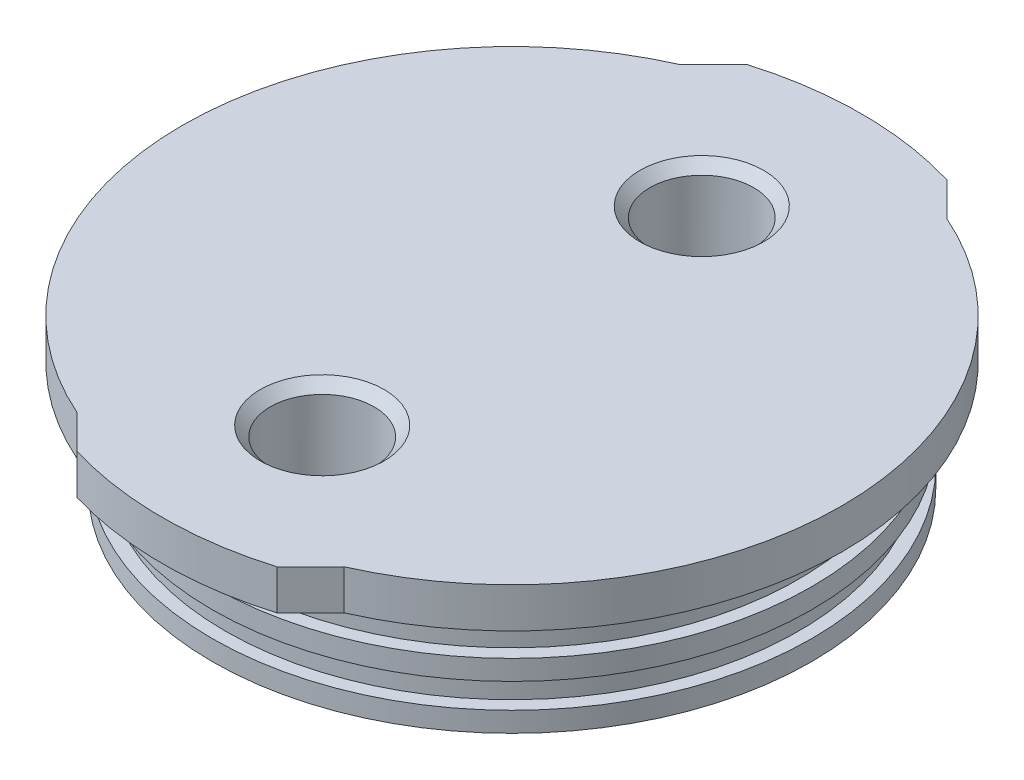
ISO-10303-21;
HEADER;
FILE_DESCRIPTION(('STEP AP214'),'2;1');
FILE_NAME('part.step','',(''),(''),'','','');
FILE_SCHEMA(('AUTOMOTIVE_DESIGN { 1 0 10303 214 1 1 1 1 }'));
ENDSEC;
DATA;
#1=APPLICATION_CONTEXT('core data for automotive mechanical design processes');
#2=APPLICATION_PROTOCOL_DEFINITION('international standard','automotive_design',2000,#1);
#3=PRODUCT_CONTEXT('',#1,'mechanical');
#4=PRODUCT('Part','Part','',(#3));
#5=PRODUCT_RELATED_PRODUCT_CATEGORY('part','',(#4));
#6=PRODUCT_DEFINITION_FORMATION('','',#4);
#7=PRODUCT_DEFINITION_CONTEXT('part definition',#1,'design');
#8=PRODUCT_DEFINITION('design','',#6,#7);
#9=PRODUCT_DEFINITION_SHAPE('','',#8);
#10=(LENGTH_UNIT() NAMED_UNIT(*) SI_UNIT(.MILLI.,.METRE.));
#11=(NAMED_UNIT(*) PLANE_ANGLE_UNIT() SI_UNIT($,.RADIAN.));
#12=(NAMED_UNIT(*) SI_UNIT($,.STERADIAN.) SOLID_ANGLE_UNIT());
#13=UNCERTAINTY_MEASURE_WITH_UNIT(LENGTH_MEASURE(1.E-05),#10,'distance_accuracy_value','');
#14=(GEOMETRIC_REPRESENTATION_CONTEXT(3) GLOBAL_UNCERTAINTY_ASSIGNED_CONTEXT((#13)) GLOBAL_UNIT_ASSIGNED_CONTEXT((#10,
#11,#12)) REPRESENTATION_CONTEXT('',''));
#15=CARTESIAN_POINT('',(0.,0.,0.));
#16=DIRECTION('',(0.,0.,1.));
#17=DIRECTION('',(1.,0.,0.));
#18=AXIS2_PLACEMENT_3D('',#15,#16,#17);
#19=CARTESIAN_POINT('',(0.,0.,0.));
#20=DIRECTION('',(0.,-1.,0.));
#21=DIRECTION('',(0.,0.,-1.));
#22=AXIS2_PLACEMENT_3D('',#19,#20,#21);
#23=CYLINDRICAL_SURFACE('',#22,33.);
#24=CARTESIAN_POINT('',(0.,11.,0.));
#25=DIRECTION('',(0.,-1.,0.));
#26=DIRECTION('',(0.,0.,-1.));
#27=AXIS2_PLACEMENT_3D('',#24,#25,#26);
#28=CIRCLE('',#27,33.);
#29=CARTESIAN_POINT('',(-13.3714085884062,11.,30.1696110740907));
#30=VERTEX_POINT('',#29);
#31=CARTESIAN_POINT('',(-13.3714085884061,11.,-30.1696110740907));
#32=VERTEX_POINT('',#31);
#33=EDGE_CURVE('E223',#30,#32,#28,.T.);
#34=ORIENTED_EDGE('',*,*,#33,.F.);
#35=DIRECTION('',(0.,1.,0.));
#36=VECTOR('',#35,1.);
#37=CARTESIAN_POINT('',(-13.3714085884061,-16.1755575421729,30.1696110740907));
#38=LINE('',#37,#36);
#39=CARTESIAN_POINT('',(-13.3714085884061,15.,30.1696110740907));
#40=VERTEX_POINT('',#39);
#41=EDGE_CURVE('E37',#30,#40,#38,.T.);
#42=ORIENTED_EDGE('',*,*,#41,.T.);
#43=CARTESIAN_POINT('',(0.,15.,0.));
#44=DIRECTION('',(0.,-1.,0.));
#45=DIRECTION('',(0.,0.,-1.));
#46=AXIS2_PLACEMENT_3D('',#43,#44,#45);
#47=CIRCLE('',#46,33.);
#48=CARTESIAN_POINT('',(-13.3714085884061,15.,-30.1696110740907));
#49=VERTEX_POINT('',#48);
#50=EDGE_CURVE('E228',#40,#49,#47,.T.);
#51=ORIENTED_EDGE('',*,*,#50,.T.);
#52=DIRECTION('',(0.,1.,0.));
#53=VECTOR('',#52,1.);
#54=CARTESIAN_POINT('',(-13.3714085884061,-16.1755575421729,-30.1696110740907));
#55=LINE('',#54,#53);
#56=EDGE_CURVE('E175',#32,#49,#55,.T.);
#57=ORIENTED_EDGE('',*,*,#56,.F.);
#58=EDGE_LOOP('',(#34,#42,#51,#57));
#59=FACE_BOUND('',#58,.T.);
#60=ADVANCED_FACE('F17',(#59),#23,.T.);
#61=CARTESIAN_POINT('',(0.,15.,0.));
#62=DIRECTION('',(0.,-1.,0.));
#63=DIRECTION('',(0.,0.,-1.));
#64=AXIS2_PLACEMENT_3D('',#61,#62,#63);
#65=PLANE('',#64);
#66=CARTESIAN_POINT('',(0.,15.,19.));
#67=DIRECTION('',(0.,-1.,0.));
#68=DIRECTION('',(0.,0.,-1.));
#69=AXIS2_PLACEMENT_3D('',#66,#67,#68);
#70=CIRCLE('',#69,6.2);
#71=CARTESIAN_POINT('',(0.,15.,12.8));
#72=VERTEX_POINT('',#71);
#73=EDGE_CURVE('E248',#72,#72,#70,.T.);
#74=ORIENTED_EDGE('',*,*,#73,.T.);
#75=EDGE_LOOP('',(#74));
#76=FACE_BOUND('',#75,.T.);
#77=CARTESIAN_POINT('',(0.,15.,-19.));
#78=DIRECTION('',(0.,-1.,0.));
#79=DIRECTION('',(0.,0.,-1.));
#80=AXIS2_PLACEMENT_3D('',#77,#78,#79);
#81=CIRCLE('',#80,6.2);
#82=CARTESIAN_POINT('',(0.,15.,-25.2));
#83=VERTEX_POINT('',#82);
#84=EDGE_CURVE('E240',#83,#83,#81,.T.);
#85=ORIENTED_EDGE('',*,*,#84,.T.);
#86=EDGE_LOOP('',(#85));
#87=FACE_BOUND('',#86,.T.);
#88=CARTESIAN_POINT('',(13.3714085884061,15.,-30.1696110740907));
#89=VERTEX_POINT('',#88);
#90=CARTESIAN_POINT('',(13.3714085884061,15.,30.1696110740907));
#91=VERTEX_POINT('',#90);
#92=EDGE_CURVE('E229',#89,#91,#47,.T.);
#93=ORIENTED_EDGE('',*,*,#92,.F.);
#94=DIRECTION('',(-0.70710678118655,0.,-0.707106781186545));
#95=VECTOR('',#94,1.);
#96=CARTESIAN_POINT('',(10.,15.,-33.5410196624969));
#97=LINE('',#96,#95);
#98=CARTESIAN_POINT('',(10.,15.,-33.5410196624969));
#99=VERTEX_POINT('',#98);
#100=EDGE_CURVE('E162',#89,#99,#97,.T.);
#101=ORIENTED_EDGE('',*,*,#100,.T.);
#102=CARTESIAN_POINT('',(0.,15.,0.));
#103=DIRECTION('',(0.,1.,0.));
#104=DIRECTION('',(0.,0.,1.));
#105=AXIS2_PLACEMENT_3D('',#102,#103,#104);
#106=CIRCLE('',#105,35.);
#107=CARTESIAN_POINT('',(-10.,15.,-33.5410196624969));
#108=VERTEX_POINT('',#107);
#109=EDGE_CURVE('E166',#99,#108,#106,.T.);
#110=ORIENTED_EDGE('',*,*,#109,.T.);
#111=DIRECTION('',(-0.70710678118655,0.,0.707106781186545));
#112=VECTOR('',#111,1.);
#113=CARTESIAN_POINT('',(-10.,15.,-33.5410196624969));
#114=LINE('',#113,#112);
#115=EDGE_CURVE('E150',#108,#49,#114,.T.);
#116=ORIENTED_EDGE('',*,*,#115,.T.);
#117=ORIENTED_EDGE('',*,*,#50,.F.);
#118=DIRECTION('',(0.70710678118655,0.,0.707106781186545));
#119=VECTOR('',#118,1.);
#120=CARTESIAN_POINT('',(-10.,15.,33.5410196624969));
#121=LINE('',#120,#119);
#122=CARTESIAN_POINT('',(-10.,15.,33.5410196624969));
#123=VERTEX_POINT('',#122);
#124=EDGE_CURVE('E125',#40,#123,#121,.T.);
#125=ORIENTED_EDGE('',*,*,#124,.T.);
#126=CARTESIAN_POINT('',(0.,15.,0.));
#127=DIRECTION('',(0.,1.,0.));
#128=DIRECTION('',(0.,0.,-1.));
#129=AXIS2_PLACEMENT_3D('',#126,#127,#128);
#130=CIRCLE('',#129,35.);
#131=CARTESIAN_POINT('',(10.,15.,33.5410196624969));
#132=VERTEX_POINT('',#131);
#133=EDGE_CURVE('E110',#123,#132,#130,.T.);
#134=ORIENTED_EDGE('',*,*,#133,.T.);
#135=DIRECTION('',(0.70710678118655,0.,-0.707106781186545));
#136=VECTOR('',#135,1.);
#137=CARTESIAN_POINT('',(10.,15.,33.5410196624969));
#138=LINE('',#137,#136);
#139=EDGE_CURVE('E122',#132,#91,#138,.T.);
#140=ORIENTED_EDGE('',*,*,#139,.T.);
#141=EDGE_LOOP('',(#93,#101,#110,#116,#117,#125,#134,#140));
#142=FACE_BOUND('',#141,.T.);
#143=ADVANCED_FACE('F121',(#76,#87,#142),#65,.F.);
#144=CARTESIAN_POINT('',(-30.,0.,0.));
#145=DIRECTION('',(0.,1.,0.));
#146=DIRECTION('',(0.,0.,1.));
#147=AXIS2_PLACEMENT_3D('',#144,#145,#146);
#148=PLANE('',#147);
#149=CARTESIAN_POINT('',(0.,0.,19.));
#150=DIRECTION('',(0.,1.,0.));
#151=DIRECTION('',(0.,0.,1.));
#152=AXIS2_PLACEMENT_3D('',#149,#150,#151);
#153=CIRCLE('',#152,6.2);
#154=CARTESIAN_POINT('',(0.,0.,25.2));
#155=VERTEX_POINT('',#154);
#156=EDGE_CURVE('E11',#155,#155,#153,.T.);
#157=ORIENTED_EDGE('',*,*,#156,.T.);
#158=EDGE_LOOP('',(#157));
#159=FACE_BOUND('',#158,.T.);
#160=CARTESIAN_POINT('',(0.,0.,-19.));
#161=DIRECTION('',(0.,1.,0.));
#162=DIRECTION('',(0.,0.,1.));
#163=AXIS2_PLACEMENT_3D('',#160,#161,#162);
#164=CIRCLE('',#163,6.2);
#165=CARTESIAN_POINT('',(0.,0.,-12.8));
#166=VERTEX_POINT('',#165);
#167=EDGE_CURVE('E244',#166,#166,#164,.T.);
#168=ORIENTED_EDGE('',*,*,#167,.T.);
#169=EDGE_LOOP('',(#168));
#170=FACE_BOUND('',#169,.T.);
#171=CARTESIAN_POINT('',(0.,0.,0.));
#172=DIRECTION('',(0.,-1.,0.));
#173=DIRECTION('',(0.,0.,-1.));
#174=AXIS2_PLACEMENT_3D('',#171,#172,#173);
#175=CIRCLE('',#174,30.);
#176=CARTESIAN_POINT('',(0.,0.,-30.));
#177=VERTEX_POINT('',#176);
#178=EDGE_CURVE('E183',#177,#177,#175,.T.);
#179=ORIENTED_EDGE('',*,*,#178,.T.);
#180=EDGE_LOOP('',(#179));
#181=FACE_BOUND('',#180,.T.);
#182=ADVANCED_FACE('F270',(#159,#170,#181),#148,.F.);
#183=ORIENTED_EDGE('',*,*,#92,.T.);
#184=DIRECTION('',(0.,1.,0.));
#185=VECTOR('',#184,1.);
#186=CARTESIAN_POINT('',(13.3714085884061,-16.1755575421729,30.1696110740907));
#187=LINE('',#186,#185);
#188=CARTESIAN_POINT('',(13.3714085884061,11.,30.1696110740907));
#189=VERTEX_POINT('',#188);
#190=EDGE_CURVE('E115',#189,#91,#187,.T.);
#191=ORIENTED_EDGE('',*,*,#190,.F.);
#192=CARTESIAN_POINT('',(13.3714085884062,11.,-30.1696110740907));
#193=VERTEX_POINT('',#192);
#194=EDGE_CURVE('E224',#193,#189,#28,.T.);
#195=ORIENTED_EDGE('',*,*,#194,.F.);
#196=DIRECTION('',(0.,1.,0.));
#197=VECTOR('',#196,1.);
#198=CARTESIAN_POINT('',(13.3714085884061,-16.1755575421729,-30.1696110740907));
#199=LINE('',#198,#197);
#200=EDGE_CURVE('E47',#193,#89,#199,.T.);
#201=ORIENTED_EDGE('',*,*,#200,.T.);
#202=EDGE_LOOP('',(#183,#191,#195,#201));
#203=FACE_BOUND('',#202,.T.);
#204=ADVANCED_FACE('F295',(#203),#23,.T.);
#205=CARTESIAN_POINT('',(-33.,11.,0.));
#206=DIRECTION('',(0.,1.,0.));
#207=DIRECTION('',(0.,0.,1.));
#208=AXIS2_PLACEMENT_3D('',#205,#206,#207);
#209=PLANE('',#208);
#210=CARTESIAN_POINT('',(0.,11.,0.));
#211=DIRECTION('',(0.,-1.,0.));
#212=DIRECTION('',(0.,0.,-1.));
#213=AXIS2_PLACEMENT_3D('',#210,#211,#212);
#214=CIRCLE('',#213,30.);
#215=CARTESIAN_POINT('',(0.,11.,-30.));
#216=VERTEX_POINT('',#215);
#217=EDGE_CURVE('E219',#216,#216,#214,.T.);
#218=ORIENTED_EDGE('',*,*,#217,.F.);
#219=EDGE_LOOP('',(#218));
#220=FACE_BOUND('',#219,.T.);
#221=ORIENTED_EDGE('',*,*,#194,.T.);
#222=DIRECTION('',(-0.70710678118655,0.,0.707106781186545));
#223=VECTOR('',#222,1.);
#224=CARTESIAN_POINT('',(10.,11.,33.5410196624969));
#225=LINE('',#224,#223);
#226=CARTESIAN_POINT('',(10.,11.,33.5410196624969));
#227=VERTEX_POINT('',#226);
#228=EDGE_CURVE('E147',#189,#227,#225,.T.);
#229=ORIENTED_EDGE('',*,*,#228,.T.);
#230=CARTESIAN_POINT('',(0.,11.,0.));
#231=DIRECTION('',(0.,1.,0.));
#232=DIRECTION('',(0.,0.,1.));
#233=AXIS2_PLACEMENT_3D('',#230,#231,#232);
#234=CIRCLE('',#233,35.);
#235=CARTESIAN_POINT('',(-10.,11.,33.5410196624969));
#236=VERTEX_POINT('',#235);
#237=EDGE_CURVE('E111',#227,#236,#234,.F.);
#238=ORIENTED_EDGE('',*,*,#237,.T.);
#239=DIRECTION('',(-0.70710678118655,0.,-0.707106781186545));
#240=VECTOR('',#239,1.);
#241=CARTESIAN_POINT('',(-10.,11.,33.5410196624969));
#242=LINE('',#241,#240);
#243=EDGE_CURVE('E142',#236,#30,#242,.T.);
#244=ORIENTED_EDGE('',*,*,#243,.T.);
#245=ORIENTED_EDGE('',*,*,#33,.T.);
#246=DIRECTION('',(0.70710678118655,0.,-0.707106781186545));
#247=VECTOR('',#246,1.);
#248=CARTESIAN_POINT('',(-10.,11.,-33.5410196624969));
#249=LINE('',#248,#247);
#250=CARTESIAN_POINT('',(-10.,11.,-33.5410196624969));
#251=VERTEX_POINT('',#250);
#252=EDGE_CURVE('E158',#32,#251,#249,.T.);
#253=ORIENTED_EDGE('',*,*,#252,.T.);
#254=CARTESIAN_POINT('',(0.,11.,0.));
#255=DIRECTION('',(0.,1.,0.));
#256=DIRECTION('',(0.,0.,1.));
#257=AXIS2_PLACEMENT_3D('',#254,#255,#256);
#258=CIRCLE('',#257,35.);
#259=CARTESIAN_POINT('',(10.,11.,-33.5410196624969));
#260=VERTEX_POINT('',#259);
#261=EDGE_CURVE('E154',#251,#260,#258,.F.);
#262=ORIENTED_EDGE('',*,*,#261,.T.);
#263=DIRECTION('',(0.70710678118655,0.,0.707106781186545));
#264=VECTOR('',#263,1.);
#265=CARTESIAN_POINT('',(10.,11.,-33.5410196624969));
#266=LINE('',#265,#264);
#267=EDGE_CURVE('E151',#260,#193,#266,.T.);
#268=ORIENTED_EDGE('',*,*,#267,.T.);
#269=EDGE_LOOP('',(#221,#229,#238,#244,#245,#253,#262,#268));
#270=FACE_BOUND('',#269,.T.);
#271=ADVANCED_FACE('F350',(#220,#270),#209,.F.);
#272=CARTESIAN_POINT('',(0.,0.,0.));
#273=DIRECTION('',(0.,-1.,0.));
#274=DIRECTION('',(0.,0.,-1.));
#275=AXIS2_PLACEMENT_3D('',#272,#273,#274);
#276=CYLINDRICAL_SURFACE('',#275,30.);
#277=CARTESIAN_POINT('',(0.,9.,0.));
#278=DIRECTION('',(0.,-1.,0.));
#279=DIRECTION('',(0.,0.,-1.));
#280=AXIS2_PLACEMENT_3D('',#277,#278,#279);
#281=CIRCLE('',#280,30.);
#282=CARTESIAN_POINT('',(0.,9.,-30.));
#283=VERTEX_POINT('',#282);
#284=EDGE_CURVE('E215',#283,#283,#281,.T.);
#285=ORIENTED_EDGE('',*,*,#284,.F.);
#286=EDGE_LOOP('',(#285));
#287=FACE_BOUND('',#286,.T.);
#288=ORIENTED_EDGE('',*,*,#217,.T.);
#289=EDGE_LOOP('',(#288));
#290=FACE_BOUND('',#289,.T.);
#291=ADVANCED_FACE('F344',(#287,#290),#276,.T.);
#292=CARTESIAN_POINT('',(-30.,9.,0.));
#293=DIRECTION('',(0.,1.,0.));
#294=DIRECTION('',(0.,0.,1.));
#295=AXIS2_PLACEMENT_3D('',#292,#293,#294);
#296=PLANE('',#295);
#297=CARTESIAN_POINT('',(0.,9.,0.));
#298=DIRECTION('',(0.,-1.,0.));
#299=DIRECTION('',(0.,0.,-1.));
#300=AXIS2_PLACEMENT_3D('',#297,#298,#299);
#301=CIRCLE('',#300,28.7);
#302=CARTESIAN_POINT('',(0.,9.,-28.7));
#303=VERTEX_POINT('',#302);
#304=EDGE_CURVE('E211',#303,#303,#301,.T.);
#305=ORIENTED_EDGE('',*,*,#304,.F.);
#306=EDGE_LOOP('',(#305));
#307=FACE_BOUND('',#306,.T.);
#308=ORIENTED_EDGE('',*,*,#284,.T.);
#309=EDGE_LOOP('',(#308));
#310=FACE_BOUND('',#309,.T.);
#311=ADVANCED_FACE('F338',(#307,#310),#296,.F.);
#312=CARTESIAN_POINT('',(0.,0.,0.));
#313=DIRECTION('',(0.,-1.,0.));
#314=DIRECTION('',(0.,0.,-1.));
#315=AXIS2_PLACEMENT_3D('',#312,#313,#314);
#316=CYLINDRICAL_SURFACE('',#315,28.7);
#317=CARTESIAN_POINT('',(0.,6.5,0.));
#318=DIRECTION('',(0.,-1.,0.));
#319=DIRECTION('',(0.,0.,-1.));
#320=AXIS2_PLACEMENT_3D('',#317,#318,#319);
#321=CIRCLE('',#320,28.7);
#322=CARTESIAN_POINT('',(0.,6.5,-28.7));
#323=VERTEX_POINT('',#322);
#324=EDGE_CURVE('E207',#323,#323,#321,.T.);
#325=ORIENTED_EDGE('',*,*,#324,.F.);
#326=EDGE_LOOP('',(#325));
#327=FACE_BOUND('',#326,.T.);
#328=ORIENTED_EDGE('',*,*,#304,.T.);
#329=EDGE_LOOP('',(#328));
#330=FACE_BOUND('',#329,.T.);
#331=ADVANCED_FACE('F332',(#327,#330),#316,.T.);
#332=CARTESIAN_POINT('',(-28.7,6.5,0.));
#333=DIRECTION('',(0.,-1.,0.));
#334=DIRECTION('',(0.,0.,-1.));
#335=AXIS2_PLACEMENT_3D('',#332,#333,#334);
#336=PLANE('',#335);
#337=CARTESIAN_POINT('',(0.,6.5,0.));
#338=DIRECTION('',(0.,-1.,0.));
#339=DIRECTION('',(0.,0.,-1.));
#340=AXIS2_PLACEMENT_3D('',#337,#338,#339);
#341=CIRCLE('',#340,30.);
#342=CARTESIAN_POINT('',(0.,6.5,-30.));
#343=VERTEX_POINT('',#342);
#344=EDGE_CURVE('E203',#343,#343,#341,.T.);
#345=ORIENTED_EDGE('',*,*,#344,.F.);
#346=EDGE_LOOP('',(#345));
#347=FACE_BOUND('',#346,.T.);
#348=ORIENTED_EDGE('',*,*,#324,.T.);
#349=EDGE_LOOP('',(#348));
#350=FACE_BOUND('',#349,.T.);
#351=ADVANCED_FACE('F326',(#347,#350),#336,.F.);
#352=CARTESIAN_POINT('',(0.,0.,0.));
#353=DIRECTION('',(0.,-1.,0.));
#354=DIRECTION('',(0.,0.,-1.));
#355=AXIS2_PLACEMENT_3D('',#352,#353,#354);
#356=CYLINDRICAL_SURFACE('',#355,30.);
#357=CARTESIAN_POINT('',(0.,4.5,0.));
#358=DIRECTION('',(0.,-1.,0.));
#359=DIRECTION('',(0.,0.,-1.));
#360=AXIS2_PLACEMENT_3D('',#357,#358,#359);
#361=CIRCLE('',#360,30.);
#362=CARTESIAN_POINT('',(0.,4.5,-30.));
#363=VERTEX_POINT('',#362);
#364=EDGE_CURVE('E199',#363,#363,#361,.T.);
#365=ORIENTED_EDGE('',*,*,#364,.F.);
#366=EDGE_LOOP('',(#365));
#367=FACE_BOUND('',#366,.T.);
#368=ORIENTED_EDGE('',*,*,#344,.T.);
#369=EDGE_LOOP('',(#368));
#370=FACE_BOUND('',#369,.T.);
#371=ADVANCED_FACE('F320',(#367,#370),#356,.T.);
#372=CARTESIAN_POINT('',(-30.,4.5,0.));
#373=DIRECTION('',(0.,1.,0.));
#374=DIRECTION('',(0.,0.,1.));
#375=AXIS2_PLACEMENT_3D('',#372,#373,#374);
#376=PLANE('',#375);
#377=CARTESIAN_POINT('',(0.,4.5,0.));
#378=DIRECTION('',(0.,-1.,0.));
#379=DIRECTION('',(0.,0.,-1.));
#380=AXIS2_PLACEMENT_3D('',#377,#378,#379);
#381=CIRCLE('',#380,28.7);
#382=CARTESIAN_POINT('',(0.,4.5,-28.7));
#383=VERTEX_POINT('',#382);
#384=EDGE_CURVE('E195',#383,#383,#381,.T.);
#385=ORIENTED_EDGE('',*,*,#384,.F.);
#386=EDGE_LOOP('',(#385));
#387=FACE_BOUND('',#386,.T.);
#388=ORIENTED_EDGE('',*,*,#364,.T.);
#389=EDGE_LOOP('',(#388));
#390=FACE_BOUND('',#389,.T.);
#391=ADVANCED_FACE('F314',(#387,#390),#376,.F.);
#392=CARTESIAN_POINT('',(0.,0.,0.));
#393=DIRECTION('',(0.,-1.,0.));
#394=DIRECTION('',(0.,0.,-1.));
#395=AXIS2_PLACEMENT_3D('',#392,#393,#394);
#396=CYLINDRICAL_SURFACE('',#395,28.7);
#397=CARTESIAN_POINT('',(0.,2.,0.));
#398=DIRECTION('',(0.,-1.,0.));
#399=DIRECTION('',(0.,0.,-1.));
#400=AXIS2_PLACEMENT_3D('',#397,#398,#399);
#401=CIRCLE('',#400,28.7);
#402=CARTESIAN_POINT('',(0.,2.,-28.7));
#403=VERTEX_POINT('',#402);
#404=EDGE_CURVE('E191',#403,#403,#401,.T.);
#405=ORIENTED_EDGE('',*,*,#404,.F.);
#406=EDGE_LOOP('',(#405));
#407=FACE_BOUND('',#406,.T.);
#408=ORIENTED_EDGE('',*,*,#384,.T.);
#409=EDGE_LOOP('',(#408));
#410=FACE_BOUND('',#409,.T.);
#411=ADVANCED_FACE('F308',(#407,#410),#396,.T.);
#412=CARTESIAN_POINT('',(-28.7,2.,0.));
#413=DIRECTION('',(0.,-1.,0.));
#414=DIRECTION('',(0.,0.,-1.));
#415=AXIS2_PLACEMENT_3D('',#412,#413,#414);
#416=PLANE('',#415);
#417=CARTESIAN_POINT('',(0.,2.,0.));
#418=DIRECTION('',(0.,-1.,0.));
#419=DIRECTION('',(0.,0.,-1.));
#420=AXIS2_PLACEMENT_3D('',#417,#418,#419);
#421=CIRCLE('',#420,30.);
#422=CARTESIAN_POINT('',(0.,2.,-30.));
#423=VERTEX_POINT('',#422);
#424=EDGE_CURVE('E187',#423,#423,#421,.T.);
#425=ORIENTED_EDGE('',*,*,#424,.F.);
#426=EDGE_LOOP('',(#425));
#427=FACE_BOUND('',#426,.T.);
#428=ORIENTED_EDGE('',*,*,#404,.T.);
#429=EDGE_LOOP('',(#428));
#430=FACE_BOUND('',#429,.T.);
#431=ADVANCED_FACE('F302',(#427,#430),#416,.F.);
#432=CARTESIAN_POINT('',(0.,0.,0.));
#433=DIRECTION('',(0.,-1.,0.));
#434=DIRECTION('',(0.,0.,-1.));
#435=AXIS2_PLACEMENT_3D('',#432,#433,#434);
#436=CYLINDRICAL_SURFACE('',#435,30.);
#437=ORIENTED_EDGE('',*,*,#178,.F.);
#438=EDGE_LOOP('',(#437));
#439=FACE_BOUND('',#438,.T.);
#440=ORIENTED_EDGE('',*,*,#424,.T.);
#441=EDGE_LOOP('',(#440));
#442=FACE_BOUND('',#441,.T.);
#443=ADVANCED_FACE('F284',(#439,#442),#436,.T.);
#444=CARTESIAN_POINT('',(0.,23.4828265882864,-19.));
#445=DIRECTION('',(0.,1.,0.));
#446=DIRECTION('',(0.,0.,1.));
#447=AXIS2_PLACEMENT_3D('',#444,#445,#446);
#448=CYLINDRICAL_SURFACE('',#447,5.2);
#449=CARTESIAN_POINT('',(0.,14.,-19.));
#450=DIRECTION('',(0.,-1.,0.));
#451=DIRECTION('',(0.,0.,-1.));
#452=AXIS2_PLACEMENT_3D('',#449,#450,#451);
#453=CIRCLE('',#452,5.2);
#454=CARTESIAN_POINT('',(0.,14.,-24.2));
#455=VERTEX_POINT('',#454);
#456=EDGE_CURVE('E236',#455,#455,#453,.F.);
#457=ORIENTED_EDGE('',*,*,#456,.T.);
#458=EDGE_LOOP('',(#457));
#459=FACE_BOUND('',#458,.T.);
#460=CARTESIAN_POINT('',(0.,1.00000000000002,-19.));
#461=DIRECTION('',(0.,1.,0.));
#462=DIRECTION('',(0.,0.,1.));
#463=AXIS2_PLACEMENT_3D('',#460,#461,#462);
#464=CIRCLE('',#463,5.2);
#465=CARTESIAN_POINT('',(0.,1.00000000000002,-13.8));
#466=VERTEX_POINT('',#465);
#467=EDGE_CURVE('E232',#466,#466,#464,.F.);
#468=ORIENTED_EDGE('',*,*,#467,.T.);
#469=EDGE_LOOP('',(#468));
#470=FACE_BOUND('',#469,.T.);
#471=ADVANCED_FACE('F278',(#459,#470),#448,.F.);
#472=CARTESIAN_POINT('',(0.,14.,-19.));
#473=DIRECTION('',(0.,1.,0.));
#474=DIRECTION('',(0.,0.,1.));
#475=AXIS2_PLACEMENT_3D('',#472,#473,#474);
#476=CONICAL_SURFACE('',#475,5.2,0.785398163397447);
#477=ORIENTED_EDGE('',*,*,#84,.F.);
#478=EDGE_LOOP('',(#477));
#479=FACE_BOUND('',#478,.T.);
#480=ORIENTED_EDGE('',*,*,#456,.F.);
#481=EDGE_LOOP('',(#480));
#482=FACE_BOUND('',#481,.T.);
#483=ADVANCED_FACE('F274',(#479,#482),#476,.F.);
#484=CARTESIAN_POINT('',(0.,0.,-19.));
#485=DIRECTION('',(0.,-1.,0.));
#486=DIRECTION('',(0.,0.,-1.));
#487=AXIS2_PLACEMENT_3D('',#484,#485,#486);
#488=CONICAL_SURFACE('',#487,6.2,0.785398163397443);
#489=ORIENTED_EDGE('',*,*,#467,.F.);
#490=EDGE_LOOP('',(#489));
#491=FACE_BOUND('',#490,.T.);
#492=ORIENTED_EDGE('',*,*,#167,.F.);
#493=EDGE_LOOP('',(#492));
#494=FACE_BOUND('',#493,.T.);
#495=ADVANCED_FACE('F277',(#491,#494),#488,.F.);
#496=CARTESIAN_POINT('',(0.,23.4828265882864,19.));
#497=DIRECTION('',(0.,1.,0.));
#498=DIRECTION('',(0.,0.,-1.));
#499=AXIS2_PLACEMENT_3D('',#496,#497,#498);
#500=CYLINDRICAL_SURFACE('',#499,5.2);
#501=CARTESIAN_POINT('',(0.,14.,19.));
#502=DIRECTION('',(0.,-1.,0.));
#503=DIRECTION('',(0.,0.,-1.));
#504=AXIS2_PLACEMENT_3D('',#501,#502,#503);
#505=CIRCLE('',#504,5.2);
#506=CARTESIAN_POINT('',(0.,14.,13.8));
#507=VERTEX_POINT('',#506);
#508=EDGE_CURVE('E26',#507,#507,#505,.F.);
#509=ORIENTED_EDGE('',*,*,#508,.T.);
#510=EDGE_LOOP('',(#509));
#511=FACE_BOUND('',#510,.T.);
#512=CARTESIAN_POINT('',(0.,1.00000000000002,19.));
#513=DIRECTION('',(0.,1.,0.));
#514=DIRECTION('',(0.,0.,1.));
#515=AXIS2_PLACEMENT_3D('',#512,#513,#514);
#516=CIRCLE('',#515,5.2);
#517=CARTESIAN_POINT('',(0.,1.00000000000002,24.2));
#518=VERTEX_POINT('',#517);
#519=EDGE_CURVE('E252',#518,#518,#516,.F.);
#520=ORIENTED_EDGE('',*,*,#519,.T.);
#521=EDGE_LOOP('',(#520));
#522=FACE_BOUND('',#521,.T.);
#523=ADVANCED_FACE('F260',(#511,#522),#500,.F.);
#524=CARTESIAN_POINT('',(0.,15.,19.));
#525=DIRECTION('',(0.,1.,0.));
#526=DIRECTION('',(0.,0.,1.));
#527=AXIS2_PLACEMENT_3D('',#524,#525,#526);
#528=CONICAL_SURFACE('',#527,6.2,0.785398163397452);
#529=ORIENTED_EDGE('',*,*,#508,.F.);
#530=EDGE_LOOP('',(#529));
#531=FACE_BOUND('',#530,.T.);
#532=ORIENTED_EDGE('',*,*,#73,.F.);
#533=EDGE_LOOP('',(#532));
#534=FACE_BOUND('',#533,.T.);
#535=ADVANCED_FACE('F263',(#531,#534),#528,.F.);
#536=CARTESIAN_POINT('',(0.,1.00000000000002,19.));
#537=DIRECTION('',(0.,-1.,0.));
#538=DIRECTION('',(0.,0.,-1.));
#539=AXIS2_PLACEMENT_3D('',#536,#537,#538);
#540=CONICAL_SURFACE('',#539,5.2,0.785398163397443);
#541=ORIENTED_EDGE('',*,*,#156,.F.);
#542=EDGE_LOOP('',(#541));
#543=FACE_BOUND('',#542,.T.);
#544=ORIENTED_EDGE('',*,*,#519,.F.);
#545=EDGE_LOOP('',(#544));
#546=FACE_BOUND('',#545,.T.);
#547=ADVANCED_FACE('F19',(#543,#546),#540,.F.);
#548=CARTESIAN_POINT('',(0.,-16.1755575421729,0.));
#549=DIRECTION('',(0.,1.,0.));
#550=DIRECTION('',(0.,0.,1.));
#551=AXIS2_PLACEMENT_3D('',#548,#549,#550);
#552=CYLINDRICAL_SURFACE('',#551,35.);
#553=ORIENTED_EDGE('',*,*,#261,.F.);
#554=DIRECTION('',(0.,1.,0.));
#555=VECTOR('',#554,1.);
#556=CARTESIAN_POINT('',(-10.,-16.1755575421729,-33.5410196624969));
#557=LINE('',#556,#555);
#558=EDGE_CURVE('E170',#251,#108,#557,.T.);
#559=ORIENTED_EDGE('',*,*,#558,.T.);
#560=ORIENTED_EDGE('',*,*,#109,.F.);
#561=DIRECTION('',(0.,1.,0.));
#562=VECTOR('',#561,1.);
#563=CARTESIAN_POINT('',(10.,-16.1755575421729,-33.5410196624969));
#564=LINE('',#563,#562);
#565=EDGE_CURVE('E155',#260,#99,#564,.T.);
#566=ORIENTED_EDGE('',*,*,#565,.F.);
#567=EDGE_LOOP('',(#553,#559,#560,#566));
#568=FACE_BOUND('',#567,.T.);
#569=ADVANCED_FACE('F364',(#568),#552,.T.);
#570=CARTESIAN_POINT('',(10.,-16.1755575421729,-33.5410196624969));
#571=DIRECTION('',(0.707106781186545,0.,-0.70710678118655));
#572=DIRECTION('',(-0.70710678118655,0.,-0.707106781186545));
#573=AXIS2_PLACEMENT_3D('',#570,#571,#572);
#574=PLANE('',#573);
#575=ORIENTED_EDGE('',*,*,#267,.F.);
#576=ORIENTED_EDGE('',*,*,#565,.T.);
#577=ORIENTED_EDGE('',*,*,#100,.F.);
#578=ORIENTED_EDGE('',*,*,#200,.F.);
#579=EDGE_LOOP('',(#575,#576,#577,#578));
#580=FACE_BOUND('',#579,.T.);
#581=ADVANCED_FACE('F497',(#580),#574,.T.);
#582=CARTESIAN_POINT('',(-10.,-16.1755575421729,-33.5410196624969));
#583=DIRECTION('',(-0.707106781186545,0.,-0.70710678118655));
#584=DIRECTION('',(-0.70710678118655,0.,0.707106781186545));
#585=AXIS2_PLACEMENT_3D('',#582,#583,#584);
#586=PLANE('',#585);
#587=ORIENTED_EDGE('',*,*,#252,.F.);
#588=ORIENTED_EDGE('',*,*,#56,.T.);
#589=ORIENTED_EDGE('',*,*,#115,.F.);
#590=ORIENTED_EDGE('',*,*,#558,.F.);
#591=EDGE_LOOP('',(#587,#588,#589,#590));
#592=FACE_BOUND('',#591,.T.);
#593=ADVANCED_FACE('F368',(#592),#586,.T.);
#594=CARTESIAN_POINT('',(0.,-16.1755575421729,0.));
#595=DIRECTION('',(0.,1.,0.));
#596=DIRECTION('',(0.,0.,1.));
#597=AXIS2_PLACEMENT_3D('',#594,#595,#596);
#598=CYLINDRICAL_SURFACE('',#597,35.);
#599=ORIENTED_EDGE('',*,*,#237,.F.);
#600=DIRECTION('',(0.,1.,0.));
#601=VECTOR('',#600,1.);
#602=CARTESIAN_POINT('',(10.,-16.1755575421729,33.5410196624969));
#603=LINE('',#602,#601);
#604=EDGE_CURVE('E106',#227,#132,#603,.T.);
#605=ORIENTED_EDGE('',*,*,#604,.T.);
#606=ORIENTED_EDGE('',*,*,#133,.F.);
#607=DIRECTION('',(0.,1.,0.));
#608=VECTOR('',#607,1.);
#609=CARTESIAN_POINT('',(-10.,-16.1755575421729,33.5410196624969));
#610=LINE('',#609,#608);
#611=EDGE_CURVE('E139',#236,#123,#610,.T.);
#612=ORIENTED_EDGE('',*,*,#611,.F.);
#613=EDGE_LOOP('',(#599,#605,#606,#612));
#614=FACE_BOUND('',#613,.T.);
#615=ADVANCED_FACE('F108',(#614),#598,.T.);
#616=CARTESIAN_POINT('',(-10.,-16.1755575421729,33.5410196624969));
#617=DIRECTION('',(-0.707106781186545,0.,0.70710678118655));
#618=DIRECTION('',(0.70710678118655,0.,0.707106781186545));
#619=AXIS2_PLACEMENT_3D('',#616,#617,#618);
#620=PLANE('',#619);
#621=ORIENTED_EDGE('',*,*,#243,.F.);
#622=ORIENTED_EDGE('',*,*,#611,.T.);
#623=ORIENTED_EDGE('',*,*,#124,.F.);
#624=ORIENTED_EDGE('',*,*,#41,.F.);
#625=EDGE_LOOP('',(#621,#622,#623,#624));
#626=FACE_BOUND('',#625,.T.);
#627=ADVANCED_FACE('F516',(#626),#620,.T.);
#628=CARTESIAN_POINT('',(10.,-16.1755575421729,33.5410196624969));
#629=DIRECTION('',(0.707106781186545,0.,0.70710678118655));
#630=DIRECTION('',(0.70710678118655,0.,-0.707106781186545));
#631=AXIS2_PLACEMENT_3D('',#628,#629,#630);
#632=PLANE('',#631);
#633=ORIENTED_EDGE('',*,*,#228,.F.);
#634=ORIENTED_EDGE('',*,*,#190,.T.);
#635=ORIENTED_EDGE('',*,*,#139,.F.);
#636=ORIENTED_EDGE('',*,*,#604,.F.);
#637=EDGE_LOOP('',(#633,#634,#635,#636));
#638=FACE_BOUND('',#637,.T.);
#639=ADVANCED_FACE('F128',(#638),#632,.T.);
#640=CLOSED_SHELL('',(#60,#143,#182,#204,#271,#291,#311,#331,#351,#371,#391,#411,#431,#443,#471,
#483,#495,#523,#535,#547,#569,#581,#593,#615,#627,#639));
#641=MANIFOLD_SOLID_BREP('B1',#640);
#642=ADVANCED_BREP_SHAPE_REPRESENTATION('',(#18,#641),#14);
#643=SHAPE_DEFINITION_REPRESENTATION(#9,#642);
ENDSEC;
END-ISO-10303-21;
